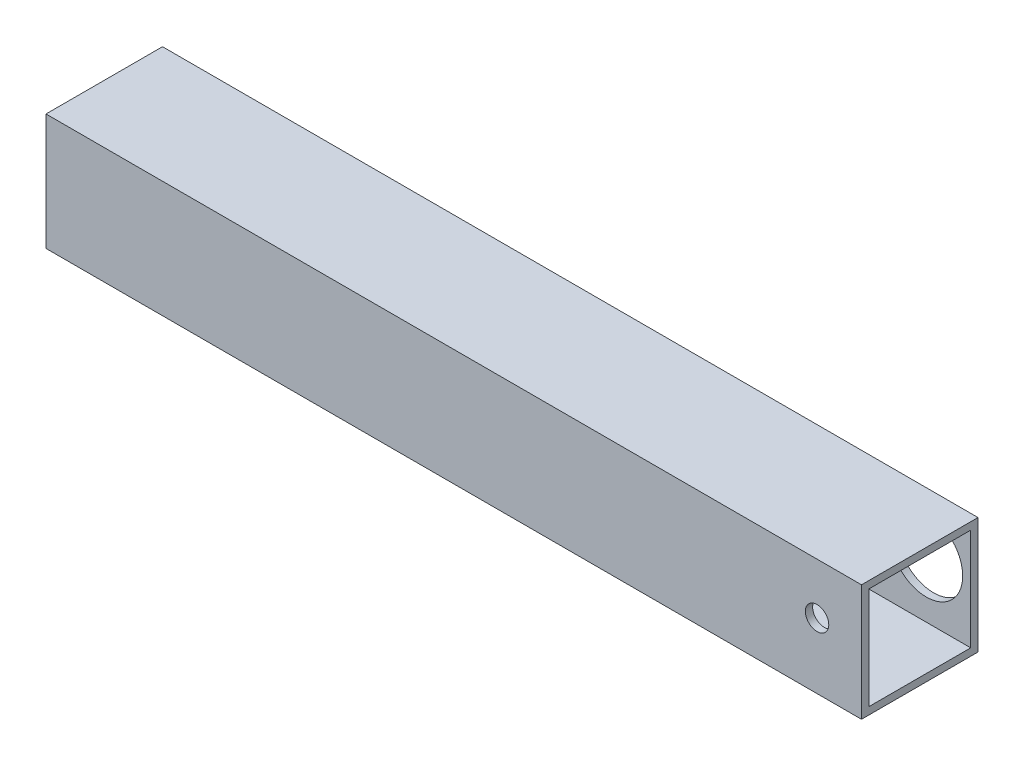
ISO-10303-21;
HEADER;
FILE_DESCRIPTION(('STEP AP214'),'2;1');
FILE_NAME('part.step','',(''),(''),'','','');
FILE_SCHEMA(('AUTOMOTIVE_DESIGN { 1 0 10303 214 1 1 1 1 }'));
ENDSEC;
DATA;
#1=APPLICATION_CONTEXT('core data for automotive mechanical design processes');
#2=APPLICATION_PROTOCOL_DEFINITION('international standard','automotive_design',2000,#1);
#3=PRODUCT_CONTEXT('',#1,'mechanical');
#4=PRODUCT('Part','Part','',(#3));
#5=PRODUCT_RELATED_PRODUCT_CATEGORY('part','',(#4));
#6=PRODUCT_DEFINITION_FORMATION('','',#4);
#7=PRODUCT_DEFINITION_CONTEXT('part definition',#1,'design');
#8=PRODUCT_DEFINITION('design','',#6,#7);
#9=PRODUCT_DEFINITION_SHAPE('','',#8);
#10=(LENGTH_UNIT() NAMED_UNIT(*) SI_UNIT(.MILLI.,.METRE.));
#11=(NAMED_UNIT(*) PLANE_ANGLE_UNIT() SI_UNIT($,.RADIAN.));
#12=(NAMED_UNIT(*) SI_UNIT($,.STERADIAN.) SOLID_ANGLE_UNIT());
#13=UNCERTAINTY_MEASURE_WITH_UNIT(LENGTH_MEASURE(1.E-05),#10,'distance_accuracy_value','');
#14=(GEOMETRIC_REPRESENTATION_CONTEXT(3) GLOBAL_UNCERTAINTY_ASSIGNED_CONTEXT((#13)) GLOBAL_UNIT_ASSIGNED_CONTEXT((#10,
#11,#12)) REPRESENTATION_CONTEXT('',''));
#15=CARTESIAN_POINT('',(0.,0.,0.));
#16=DIRECTION('',(0.,0.,1.));
#17=DIRECTION('',(1.,0.,0.));
#18=AXIS2_PLACEMENT_3D('',#15,#16,#17);
#19=CARTESIAN_POINT('',(79.213339311384,1.57357798824108,-12.7));
#20=DIRECTION('',(0.,0.,-1.));
#21=DIRECTION('',(-1.,0.,0.));
#22=AXIS2_PLACEMENT_3D('',#19,#20,#21);
#23=CYLINDRICAL_SURFACE('',#22,7.9375);
#24=CARTESIAN_POINT('',(79.213339311384,1.57357798824108,-11.1125));
#25=DIRECTION('',(0.,0.,-1.));
#26=DIRECTION('',(-1.,0.,0.));
#27=AXIS2_PLACEMENT_3D('',#24,#25,#26);
#28=CIRCLE('',#27,7.9375);
#29=CARTESIAN_POINT('',(71.275839311384,1.57357798824108,-11.1125));
#30=VERTEX_POINT('',#29);
#31=EDGE_CURVE('E118',#30,#30,#28,.T.);
#32=ORIENTED_EDGE('',*,*,#31,.F.);
#33=EDGE_LOOP('',(#32));
#34=FACE_BOUND('',#33,.T.);
#35=CARTESIAN_POINT('',(79.213339311384,1.57357798824108,-12.7));
#36=DIRECTION('',(0.,0.,-1.));
#37=DIRECTION('',(-1.,0.,0.));
#38=AXIS2_PLACEMENT_3D('',#35,#36,#37);
#39=CIRCLE('',#38,7.9375);
#40=CARTESIAN_POINT('',(71.275839311384,1.57357798824108,-12.7));
#41=VERTEX_POINT('',#40);
#42=EDGE_CURVE('E114',#41,#41,#39,.F.);
#43=ORIENTED_EDGE('',*,*,#42,.F.);
#44=EDGE_LOOP('',(#43));
#45=FACE_BOUND('',#44,.T.);
#46=ADVANCED_FACE('F16',(#34,#45),#23,.F.);
#47=CARTESIAN_POINT('',(79.213339311384,1.57357798824108,12.7));
#48=DIRECTION('',(0.,0.,1.));
#49=DIRECTION('',(1.,0.,0.));
#50=AXIS2_PLACEMENT_3D('',#47,#48,#49);
#51=CYLINDRICAL_SURFACE('',#50,2.5527);
#52=CARTESIAN_POINT('',(79.213339311384,1.57357798824108,11.1125));
#53=DIRECTION('',(0.,0.,1.));
#54=DIRECTION('',(1.,0.,0.));
#55=AXIS2_PLACEMENT_3D('',#52,#53,#54);
#56=CIRCLE('',#55,2.5527);
#57=CARTESIAN_POINT('',(81.766039311384,1.57357798824108,11.1125));
#58=VERTEX_POINT('',#57);
#59=EDGE_CURVE('E19',#58,#58,#56,.T.);
#60=ORIENTED_EDGE('',*,*,#59,.F.);
#61=EDGE_LOOP('',(#60));
#62=FACE_BOUND('',#61,.T.);
#63=CARTESIAN_POINT('',(79.213339311384,1.57357798824108,12.7));
#64=DIRECTION('',(0.,0.,1.));
#65=DIRECTION('',(1.,0.,0.));
#66=AXIS2_PLACEMENT_3D('',#63,#64,#65);
#67=CIRCLE('',#66,2.5527);
#68=CARTESIAN_POINT('',(81.766039311384,1.57357798824108,12.7));
#69=VERTEX_POINT('',#68);
#70=EDGE_CURVE('E123',#69,#69,#67,.F.);
#71=ORIENTED_EDGE('',*,*,#70,.F.);
#72=EDGE_LOOP('',(#71));
#73=FACE_BOUND('',#72,.T.);
#74=ADVANCED_FACE('F137',(#62,#73),#51,.F.);
#75=CARTESIAN_POINT('',(-88.9,12.7,-12.7));
#76=DIRECTION('',(0.,1.,0.));
#77=DIRECTION('',(0.,0.,1.));
#78=AXIS2_PLACEMENT_3D('',#75,#76,#77);
#79=PLANE('',#78);
#80=DIRECTION('',(-1.,0.,0.));
#81=VECTOR('',#80,1.);
#82=CARTESIAN_POINT('',(-88.9,12.7,-12.7));
#83=LINE('',#82,#81);
#84=CARTESIAN_POINT('',(-88.9,12.7,-12.7));
#85=VERTEX_POINT('',#84);
#86=CARTESIAN_POINT('',(88.9,12.7,-12.7));
#87=VERTEX_POINT('',#86);
#88=EDGE_CURVE('E115',#85,#87,#83,.F.);
#89=ORIENTED_EDGE('',*,*,#88,.F.);
#90=DIRECTION('',(0.,0.,-1.));
#91=VECTOR('',#90,1.);
#92=CARTESIAN_POINT('',(-88.9,12.7,0.));
#93=LINE('',#92,#91);
#94=CARTESIAN_POINT('',(-88.9,12.7,12.7));
#95=VERTEX_POINT('',#94);
#96=EDGE_CURVE('E158',#85,#95,#93,.F.);
#97=ORIENTED_EDGE('',*,*,#96,.T.);
#98=DIRECTION('',(1.,0.,0.));
#99=VECTOR('',#98,1.);
#100=CARTESIAN_POINT('',(-88.9,12.7,12.7));
#101=LINE('',#100,#99);
#102=CARTESIAN_POINT('',(88.9,12.7,12.7));
#103=VERTEX_POINT('',#102);
#104=EDGE_CURVE('E127',#103,#95,#101,.F.);
#105=ORIENTED_EDGE('',*,*,#104,.F.);
#106=DIRECTION('',(0.,0.,-1.));
#107=VECTOR('',#106,1.);
#108=CARTESIAN_POINT('',(88.9,12.7,0.));
#109=LINE('',#108,#107);
#110=EDGE_CURVE('E106',#87,#103,#109,.F.);
#111=ORIENTED_EDGE('',*,*,#110,.F.);
#112=EDGE_LOOP('',(#89,#97,#105,#111));
#113=FACE_BOUND('',#112,.T.);
#114=ADVANCED_FACE('F205',(#113),#79,.T.);
#115=CARTESIAN_POINT('',(-88.9,-11.1125,-11.1125));
#116=DIRECTION('',(0.,1.,0.));
#117=DIRECTION('',(0.,0.,1.));
#118=AXIS2_PLACEMENT_3D('',#115,#116,#117);
#119=PLANE('',#118);
#120=DIRECTION('',(1.,0.,0.));
#121=VECTOR('',#120,1.);
#122=CARTESIAN_POINT('',(-88.9,-11.1125,-11.1125));
#123=LINE('',#122,#121);
#124=CARTESIAN_POINT('',(-88.9,-11.1125,-11.1125));
#125=VERTEX_POINT('',#124);
#126=CARTESIAN_POINT('',(88.9,-11.1125,-11.1125));
#127=VERTEX_POINT('',#126);
#128=EDGE_CURVE('E90',#125,#127,#123,.T.);
#129=ORIENTED_EDGE('',*,*,#128,.F.);
#130=DIRECTION('',(0.,0.,-1.));
#131=VECTOR('',#130,1.);
#132=CARTESIAN_POINT('',(-88.9,-11.1125,0.));
#133=LINE('',#132,#131);
#134=CARTESIAN_POINT('',(-88.9,-11.1125,11.1125));
#135=VERTEX_POINT('',#134);
#136=EDGE_CURVE('E170',#125,#135,#133,.F.);
#137=ORIENTED_EDGE('',*,*,#136,.T.);
#138=DIRECTION('',(-1.,0.,0.));
#139=VECTOR('',#138,1.);
#140=CARTESIAN_POINT('',(-88.9,-11.1125,11.1125));
#141=LINE('',#140,#139);
#142=CARTESIAN_POINT('',(88.9,-11.1125,11.1125));
#143=VERTEX_POINT('',#142);
#144=EDGE_CURVE('E121',#143,#135,#141,.T.);
#145=ORIENTED_EDGE('',*,*,#144,.F.);
#146=DIRECTION('',(0.,0.,-1.));
#147=VECTOR('',#146,1.);
#148=CARTESIAN_POINT('',(88.9,-11.1125,0.));
#149=LINE('',#148,#147);
#150=EDGE_CURVE('E105',#127,#143,#149,.F.);
#151=ORIENTED_EDGE('',*,*,#150,.F.);
#152=EDGE_LOOP('',(#129,#137,#145,#151));
#153=FACE_BOUND('',#152,.T.);
#154=ADVANCED_FACE('F180',(#153),#119,.T.);
#155=CARTESIAN_POINT('',(-88.9,-11.1125,11.1125));
#156=DIRECTION('',(0.,0.,-1.));
#157=DIRECTION('',(-1.,0.,0.));
#158=AXIS2_PLACEMENT_3D('',#155,#156,#157);
#159=PLANE('',#158);
#160=ORIENTED_EDGE('',*,*,#59,.T.);
#161=EDGE_LOOP('',(#160));
#162=FACE_BOUND('',#161,.T.);
#163=ORIENTED_EDGE('',*,*,#144,.T.);
#164=DIRECTION('',(0.,1.,0.));
#165=VECTOR('',#164,1.);
#166=CARTESIAN_POINT('',(-88.9,0.,11.1125));
#167=LINE('',#166,#165);
#168=CARTESIAN_POINT('',(-88.9,11.1125,11.1125));
#169=VERTEX_POINT('',#168);
#170=EDGE_CURVE('E87',#135,#169,#167,.T.);
#171=ORIENTED_EDGE('',*,*,#170,.T.);
#172=DIRECTION('',(1.,0.,0.));
#173=VECTOR('',#172,1.);
#174=CARTESIAN_POINT('',(-88.9,11.1125,11.1125));
#175=LINE('',#174,#173);
#176=CARTESIAN_POINT('',(88.9,11.1125,11.1125));
#177=VERTEX_POINT('',#176);
#178=EDGE_CURVE('E79',#177,#169,#175,.F.);
#179=ORIENTED_EDGE('',*,*,#178,.F.);
#180=DIRECTION('',(0.,1.,0.));
#181=VECTOR('',#180,1.);
#182=CARTESIAN_POINT('',(88.9,0.,11.1125));
#183=LINE('',#182,#181);
#184=EDGE_CURVE('E84',#143,#177,#183,.T.);
#185=ORIENTED_EDGE('',*,*,#184,.F.);
#186=EDGE_LOOP('',(#163,#171,#179,#185));
#187=FACE_BOUND('',#186,.T.);
#188=ADVANCED_FACE('F82',(#162,#187),#159,.T.);
#189=CARTESIAN_POINT('',(-88.9,11.1125,11.1125));
#190=DIRECTION('',(0.,-1.,0.));
#191=DIRECTION('',(0.,0.,-1.));
#192=AXIS2_PLACEMENT_3D('',#189,#190,#191);
#193=PLANE('',#192);
#194=ORIENTED_EDGE('',*,*,#178,.T.);
#195=DIRECTION('',(0.,0.,-1.));
#196=VECTOR('',#195,1.);
#197=CARTESIAN_POINT('',(-88.9,11.1125,0.));
#198=LINE('',#197,#196);
#199=CARTESIAN_POINT('',(-88.9,11.1125,-11.1125));
#200=VERTEX_POINT('',#199);
#201=EDGE_CURVE('E167',#169,#200,#198,.T.);
#202=ORIENTED_EDGE('',*,*,#201,.T.);
#203=DIRECTION('',(1.,0.,0.));
#204=VECTOR('',#203,1.);
#205=CARTESIAN_POINT('',(-88.9,11.1125,-11.1125));
#206=LINE('',#205,#204);
#207=CARTESIAN_POINT('',(88.9,11.1125,-11.1125));
#208=VERTEX_POINT('',#207);
#209=EDGE_CURVE('E96',#208,#200,#206,.F.);
#210=ORIENTED_EDGE('',*,*,#209,.F.);
#211=DIRECTION('',(0.,0.,-1.));
#212=VECTOR('',#211,1.);
#213=CARTESIAN_POINT('',(88.9,11.1125,0.));
#214=LINE('',#213,#212);
#215=EDGE_CURVE('E93',#177,#208,#214,.T.);
#216=ORIENTED_EDGE('',*,*,#215,.F.);
#217=EDGE_LOOP('',(#194,#202,#210,#216));
#218=FACE_BOUND('',#217,.T.);
#219=ADVANCED_FACE('F94',(#218),#193,.T.);
#220=CARTESIAN_POINT('',(-88.9,11.1125,-11.1125));
#221=DIRECTION('',(0.,0.,1.));
#222=DIRECTION('',(1.,0.,0.));
#223=AXIS2_PLACEMENT_3D('',#220,#221,#222);
#224=PLANE('',#223);
#225=ORIENTED_EDGE('',*,*,#31,.T.);
#226=EDGE_LOOP('',(#225));
#227=FACE_BOUND('',#226,.T.);
#228=ORIENTED_EDGE('',*,*,#209,.T.);
#229=DIRECTION('',(0.,1.,0.));
#230=VECTOR('',#229,1.);
#231=CARTESIAN_POINT('',(-88.9,0.,-11.1125));
#232=LINE('',#231,#230);
#233=EDGE_CURVE('E153',#200,#125,#232,.F.);
#234=ORIENTED_EDGE('',*,*,#233,.T.);
#235=ORIENTED_EDGE('',*,*,#128,.T.);
#236=DIRECTION('',(0.,1.,0.));
#237=VECTOR('',#236,1.);
#238=CARTESIAN_POINT('',(88.9,0.,-11.1125));
#239=LINE('',#238,#237);
#240=EDGE_CURVE('E100',#208,#127,#239,.F.);
#241=ORIENTED_EDGE('',*,*,#240,.F.);
#242=EDGE_LOOP('',(#228,#234,#235,#241));
#243=FACE_BOUND('',#242,.T.);
#244=ADVANCED_FACE('F132',(#227,#243),#224,.T.);
#245=CARTESIAN_POINT('',(-88.9,-12.7,-12.7));
#246=DIRECTION('',(0.,0.,-1.));
#247=DIRECTION('',(-1.,0.,0.));
#248=AXIS2_PLACEMENT_3D('',#245,#246,#247);
#249=PLANE('',#248);
#250=ORIENTED_EDGE('',*,*,#42,.T.);
#251=EDGE_LOOP('',(#250));
#252=FACE_BOUND('',#251,.T.);
#253=DIRECTION('',(1.,0.,0.));
#254=VECTOR('',#253,1.);
#255=CARTESIAN_POINT('',(-88.9,-12.7,-12.7));
#256=LINE('',#255,#254);
#257=CARTESIAN_POINT('',(-88.9,-12.7,-12.7));
#258=VERTEX_POINT('',#257);
#259=CARTESIAN_POINT('',(88.9,-12.7,-12.7));
#260=VERTEX_POINT('',#259);
#261=EDGE_CURVE('E146',#258,#260,#256,.T.);
#262=ORIENTED_EDGE('',*,*,#261,.F.);
#263=DIRECTION('',(0.,1.,0.));
#264=VECTOR('',#263,1.);
#265=CARTESIAN_POINT('',(-88.9,0.,-12.7));
#266=LINE('',#265,#264);
#267=EDGE_CURVE('E126',#258,#85,#266,.T.);
#268=ORIENTED_EDGE('',*,*,#267,.T.);
#269=ORIENTED_EDGE('',*,*,#88,.T.);
#270=DIRECTION('',(0.,1.,0.));
#271=VECTOR('',#270,1.);
#272=CARTESIAN_POINT('',(88.9,0.,-12.7));
#273=LINE('',#272,#271);
#274=EDGE_CURVE('E108',#260,#87,#273,.T.);
#275=ORIENTED_EDGE('',*,*,#274,.F.);
#276=EDGE_LOOP('',(#262,#268,#269,#275));
#277=FACE_BOUND('',#276,.T.);
#278=ADVANCED_FACE('F140',(#252,#277),#249,.T.);
#279=CARTESIAN_POINT('',(88.9,0.,0.));
#280=DIRECTION('',(1.,0.,0.));
#281=DIRECTION('',(0.,0.,-1.));
#282=AXIS2_PLACEMENT_3D('',#279,#280,#281);
#283=PLANE('',#282);
#284=ORIENTED_EDGE('',*,*,#240,.T.);
#285=ORIENTED_EDGE('',*,*,#150,.T.);
#286=ORIENTED_EDGE('',*,*,#184,.T.);
#287=ORIENTED_EDGE('',*,*,#215,.T.);
#288=EDGE_LOOP('',(#284,#285,#286,#287));
#289=FACE_BOUND('',#288,.T.);
#290=DIRECTION('',(0.,1.,0.));
#291=VECTOR('',#290,1.);
#292=CARTESIAN_POINT('',(88.9,12.7,12.7));
#293=LINE('',#292,#291);
#294=CARTESIAN_POINT('',(88.9,-12.7,12.7));
#295=VERTEX_POINT('',#294);
#296=EDGE_CURVE('E175',#295,#103,#293,.T.);
#297=ORIENTED_EDGE('',*,*,#296,.F.);
#298=DIRECTION('',(0.,0.,-1.));
#299=VECTOR('',#298,1.);
#300=CARTESIAN_POINT('',(88.9,-12.7,12.7));
#301=LINE('',#300,#299);
#302=EDGE_CURVE('E152',#260,#295,#301,.F.);
#303=ORIENTED_EDGE('',*,*,#302,.F.);
#304=ORIENTED_EDGE('',*,*,#274,.T.);
#305=ORIENTED_EDGE('',*,*,#110,.T.);
#306=EDGE_LOOP('',(#297,#303,#304,#305));
#307=FACE_BOUND('',#306,.T.);
#308=ADVANCED_FACE('F102',(#289,#307),#283,.T.);
#309=CARTESIAN_POINT('',(-88.9,12.7,12.7));
#310=DIRECTION('',(0.,0.,1.));
#311=DIRECTION('',(1.,0.,0.));
#312=AXIS2_PLACEMENT_3D('',#309,#310,#311);
#313=PLANE('',#312);
#314=ORIENTED_EDGE('',*,*,#70,.T.);
#315=EDGE_LOOP('',(#314));
#316=FACE_BOUND('',#315,.T.);
#317=ORIENTED_EDGE('',*,*,#104,.T.);
#318=DIRECTION('',(0.,1.,0.));
#319=VECTOR('',#318,1.);
#320=CARTESIAN_POINT('',(-88.9,0.,12.7));
#321=LINE('',#320,#319);
#322=CARTESIAN_POINT('',(-88.9,-12.7,12.7));
#323=VERTEX_POINT('',#322);
#324=EDGE_CURVE('E34',#95,#323,#321,.F.);
#325=ORIENTED_EDGE('',*,*,#324,.T.);
#326=DIRECTION('',(1.,0.,0.));
#327=VECTOR('',#326,1.);
#328=CARTESIAN_POINT('',(-88.9,-12.7,12.7));
#329=LINE('',#328,#327);
#330=EDGE_CURVE('E25',#295,#323,#329,.F.);
#331=ORIENTED_EDGE('',*,*,#330,.F.);
#332=ORIENTED_EDGE('',*,*,#296,.T.);
#333=EDGE_LOOP('',(#317,#325,#331,#332));
#334=FACE_BOUND('',#333,.T.);
#335=ADVANCED_FACE('F183',(#316,#334),#313,.T.);
#336=CARTESIAN_POINT('',(-88.9,0.,0.));
#337=DIRECTION('',(1.,0.,0.));
#338=DIRECTION('',(0.,0.,-1.));
#339=AXIS2_PLACEMENT_3D('',#336,#337,#338);
#340=PLANE('',#339);
#341=ORIENTED_EDGE('',*,*,#201,.F.);
#342=ORIENTED_EDGE('',*,*,#170,.F.);
#343=ORIENTED_EDGE('',*,*,#136,.F.);
#344=ORIENTED_EDGE('',*,*,#233,.F.);
#345=EDGE_LOOP('',(#341,#342,#343,#344));
#346=FACE_BOUND('',#345,.T.);
#347=ORIENTED_EDGE('',*,*,#96,.F.);
#348=ORIENTED_EDGE('',*,*,#267,.F.);
#349=DIRECTION('',(0.,0.,-1.));
#350=VECTOR('',#349,1.);
#351=CARTESIAN_POINT('',(-88.9,-12.7,12.7));
#352=LINE('',#351,#350);
#353=EDGE_CURVE('E11',#323,#258,#352,.T.);
#354=ORIENTED_EDGE('',*,*,#353,.F.);
#355=ORIENTED_EDGE('',*,*,#324,.F.);
#356=EDGE_LOOP('',(#347,#348,#354,#355));
#357=FACE_BOUND('',#356,.T.);
#358=ADVANCED_FACE('F156',(#346,#357),#340,.F.);
#359=CARTESIAN_POINT('',(-88.9,-12.7,12.7));
#360=DIRECTION('',(0.,-1.,0.));
#361=DIRECTION('',(0.,0.,-1.));
#362=AXIS2_PLACEMENT_3D('',#359,#360,#361);
#363=PLANE('',#362);
#364=ORIENTED_EDGE('',*,*,#330,.T.);
#365=ORIENTED_EDGE('',*,*,#353,.T.);
#366=ORIENTED_EDGE('',*,*,#261,.T.);
#367=ORIENTED_EDGE('',*,*,#302,.T.);
#368=EDGE_LOOP('',(#364,#365,#366,#367));
#369=FACE_BOUND('',#368,.T.);
#370=ADVANCED_FACE('F160',(#369),#363,.T.);
#371=CLOSED_SHELL('',(#46,#74,#114,#154,#188,#219,#244,#278,#308,#335,#358,#370));
#372=MANIFOLD_SOLID_BREP('B1',#371);
#373=ADVANCED_BREP_SHAPE_REPRESENTATION('',(#18,#372),#14);
#374=SHAPE_DEFINITION_REPRESENTATION(#9,#373);
ENDSEC;
END-ISO-10303-21;
